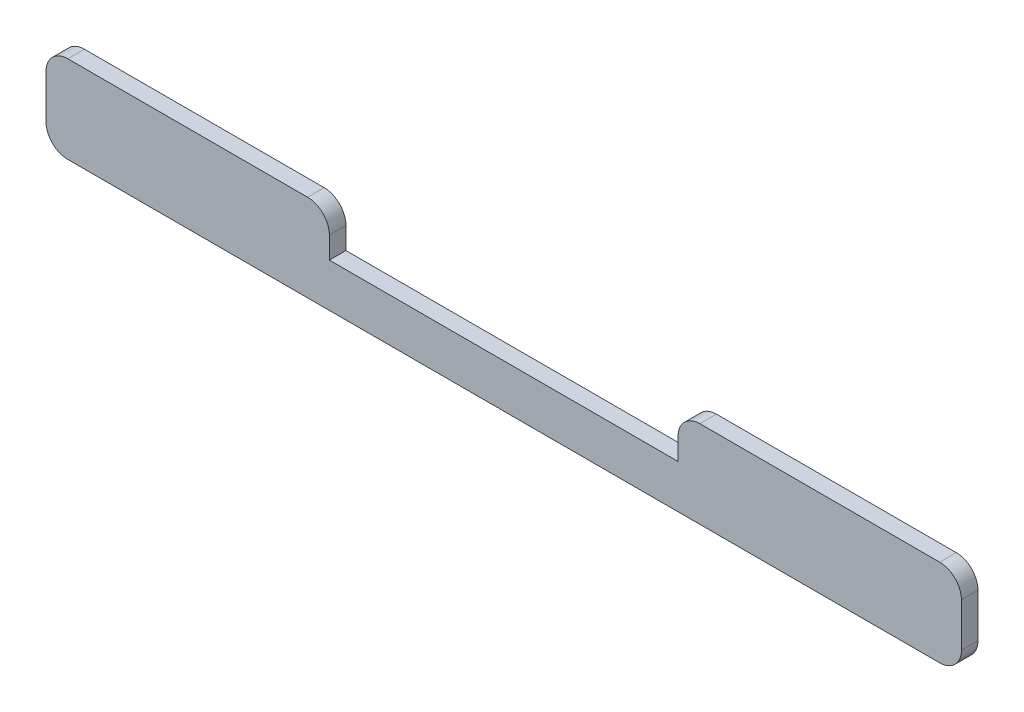
ISO-10303-21;
HEADER;
FILE_DESCRIPTION(('STEP AP214'),'2;1');
FILE_NAME('part.step','',(''),(''),'','','');
FILE_SCHEMA(('AUTOMOTIVE_DESIGN { 1 0 10303 214 1 1 1 1 }'));
ENDSEC;
DATA;
#1=APPLICATION_CONTEXT('core data for automotive mechanical design processes');
#2=APPLICATION_PROTOCOL_DEFINITION('international standard','automotive_design',2000,#1);
#3=PRODUCT_CONTEXT('',#1,'mechanical');
#4=PRODUCT('Part','Part','',(#3));
#5=PRODUCT_RELATED_PRODUCT_CATEGORY('part','',(#4));
#6=PRODUCT_DEFINITION_FORMATION('','',#4);
#7=PRODUCT_DEFINITION_CONTEXT('part definition',#1,'design');
#8=PRODUCT_DEFINITION('design','',#6,#7);
#9=PRODUCT_DEFINITION_SHAPE('','',#8);
#10=(LENGTH_UNIT() NAMED_UNIT(*) SI_UNIT(.MILLI.,.METRE.));
#11=(NAMED_UNIT(*) PLANE_ANGLE_UNIT() SI_UNIT($,.RADIAN.));
#12=(NAMED_UNIT(*) SI_UNIT($,.STERADIAN.) SOLID_ANGLE_UNIT());
#13=UNCERTAINTY_MEASURE_WITH_UNIT(LENGTH_MEASURE(1.E-05),#10,'distance_accuracy_value','');
#14=(GEOMETRIC_REPRESENTATION_CONTEXT(3) GLOBAL_UNCERTAINTY_ASSIGNED_CONTEXT((#13)) GLOBAL_UNIT_ASSIGNED_CONTEXT((#10,
#11,#12)) REPRESENTATION_CONTEXT('',''));
#15=CARTESIAN_POINT('',(0.,0.,0.));
#16=DIRECTION('',(0.,0.,1.));
#17=DIRECTION('',(1.,0.,0.));
#18=AXIS2_PLACEMENT_3D('',#15,#16,#17);
#19=CARTESIAN_POINT('',(76.2,19.05,4.826));
#20=DIRECTION('',(0.,0.,-1.));
#21=DIRECTION('',(-1.,0.,0.));
#22=AXIS2_PLACEMENT_3D('',#19,#20,#21);
#23=CYLINDRICAL_SURFACE('',#22,6.35);
#24=CARTESIAN_POINT('',(76.2,19.05,0.));
#25=DIRECTION('',(0.,0.,1.));
#26=DIRECTION('',(1.,0.,0.));
#27=AXIS2_PLACEMENT_3D('',#24,#25,#26);
#28=CIRCLE('',#27,6.35);
#29=CARTESIAN_POINT('',(76.2,25.4,0.));
#30=VERTEX_POINT('',#29);
#31=CARTESIAN_POINT('',(82.55,19.05,0.));
#32=VERTEX_POINT('',#31);
#33=EDGE_CURVE('E164',#30,#32,#28,.F.);
#34=ORIENTED_EDGE('',*,*,#33,.F.);
#35=DIRECTION('',(0.,0.,-1.));
#36=VECTOR('',#35,1.);
#37=CARTESIAN_POINT('',(76.2,25.4,4.826));
#38=LINE('',#37,#36);
#39=CARTESIAN_POINT('',(76.2,25.4,4.826));
#40=VERTEX_POINT('',#39);
#41=EDGE_CURVE('E11',#40,#30,#38,.T.);
#42=ORIENTED_EDGE('',*,*,#41,.F.);
#43=CARTESIAN_POINT('',(76.2,19.05,4.826));
#44=DIRECTION('',(0.,0.,1.));
#45=DIRECTION('',(1.,0.,0.));
#46=AXIS2_PLACEMENT_3D('',#43,#44,#45);
#47=CIRCLE('',#46,6.35);
#48=CARTESIAN_POINT('',(82.55,19.05,4.826));
#49=VERTEX_POINT('',#48);
#50=EDGE_CURVE('E201',#40,#49,#47,.F.);
#51=ORIENTED_EDGE('',*,*,#50,.T.);
#52=DIRECTION('',(0.,0.,-1.));
#53=VECTOR('',#52,1.);
#54=CARTESIAN_POINT('',(82.55,19.05,4.826));
#55=LINE('',#54,#53);
#56=EDGE_CURVE('E103',#49,#32,#55,.T.);
#57=ORIENTED_EDGE('',*,*,#56,.T.);
#58=EDGE_LOOP('',(#34,#42,#51,#57));
#59=FACE_BOUND('',#58,.T.);
#60=ADVANCED_FACE('F35',(#59),#23,.T.);
#61=CARTESIAN_POINT('',(0.,25.4,4.826));
#62=DIRECTION('',(0.,1.,0.));
#63=DIRECTION('',(0.,0.,1.));
#64=AXIS2_PLACEMENT_3D('',#61,#62,#63);
#65=PLANE('',#64);
#66=DIRECTION('',(1.,0.,0.));
#67=VECTOR('',#66,1.);
#68=CARTESIAN_POINT('',(0.,25.4,0.));
#69=LINE('',#68,#67);
#70=CARTESIAN_POINT('',(6.35000000000004,25.4,0.));
#71=VERTEX_POINT('',#70);
#72=EDGE_CURVE('E167',#71,#30,#69,.T.);
#73=ORIENTED_EDGE('',*,*,#72,.F.);
#74=DIRECTION('',(0.,0.,-1.));
#75=VECTOR('',#74,1.);
#76=CARTESIAN_POINT('',(6.35000000000004,25.4,4.826));
#77=LINE('',#76,#75);
#78=CARTESIAN_POINT('',(6.35000000000004,25.4,4.826));
#79=VERTEX_POINT('',#78);
#80=EDGE_CURVE('E43',#79,#71,#77,.T.);
#81=ORIENTED_EDGE('',*,*,#80,.F.);
#82=DIRECTION('',(1.,0.,0.));
#83=VECTOR('',#82,1.);
#84=CARTESIAN_POINT('',(0.,25.4,4.826));
#85=LINE('',#84,#83);
#86=EDGE_CURVE('E236',#79,#40,#85,.T.);
#87=ORIENTED_EDGE('',*,*,#86,.T.);
#88=ORIENTED_EDGE('',*,*,#41,.T.);
#89=EDGE_LOOP('',(#73,#81,#87,#88));
#90=FACE_BOUND('',#89,.T.);
#91=ADVANCED_FACE('F235',(#90),#65,.T.);
#92=CARTESIAN_POINT('',(6.35,19.05,4.826));
#93=DIRECTION('',(0.,0.,-1.));
#94=DIRECTION('',(-1.,0.,0.));
#95=AXIS2_PLACEMENT_3D('',#92,#93,#94);
#96=CYLINDRICAL_SURFACE('',#95,6.35);
#97=CARTESIAN_POINT('',(6.35,19.05,0.));
#98=DIRECTION('',(0.,0.,1.));
#99=DIRECTION('',(1.,0.,0.));
#100=AXIS2_PLACEMENT_3D('',#97,#98,#99);
#101=CIRCLE('',#100,6.35);
#102=CARTESIAN_POINT('',(0.,19.05,0.));
#103=VERTEX_POINT('',#102);
#104=EDGE_CURVE('E170',#71,#103,#101,.T.);
#105=ORIENTED_EDGE('',*,*,#104,.T.);
#106=DIRECTION('',(0.,0.,-1.));
#107=VECTOR('',#106,1.);
#108=CARTESIAN_POINT('',(0.,19.05,4.826));
#109=LINE('',#108,#107);
#110=CARTESIAN_POINT('',(0.,19.05,4.826));
#111=VERTEX_POINT('',#110);
#112=EDGE_CURVE('E220',#111,#103,#109,.T.);
#113=ORIENTED_EDGE('',*,*,#112,.F.);
#114=CARTESIAN_POINT('',(6.35,19.05,4.826));
#115=DIRECTION('',(0.,0.,1.));
#116=DIRECTION('',(1.,0.,0.));
#117=AXIS2_PLACEMENT_3D('',#114,#115,#116);
#118=CIRCLE('',#117,6.35);
#119=EDGE_CURVE('E226',#79,#111,#118,.T.);
#120=ORIENTED_EDGE('',*,*,#119,.F.);
#121=ORIENTED_EDGE('',*,*,#80,.T.);
#122=EDGE_LOOP('',(#105,#113,#120,#121));
#123=FACE_BOUND('',#122,.T.);
#124=ADVANCED_FACE('F224',(#123),#96,.T.);
#125=CARTESIAN_POINT('',(0.,0.,4.826));
#126=DIRECTION('',(-1.,0.,0.));
#127=DIRECTION('',(0.,0.,1.));
#128=AXIS2_PLACEMENT_3D('',#125,#126,#127);
#129=PLANE('',#128);
#130=DIRECTION('',(0.,1.,0.));
#131=VECTOR('',#130,1.);
#132=CARTESIAN_POINT('',(0.,0.,0.));
#133=LINE('',#132,#131);
#134=CARTESIAN_POINT('',(0.,6.35000000000004,0.));
#135=VERTEX_POINT('',#134);
#136=EDGE_CURVE('E173',#135,#103,#133,.T.);
#137=ORIENTED_EDGE('',*,*,#136,.F.);
#138=DIRECTION('',(0.,0.,-1.));
#139=VECTOR('',#138,1.);
#140=CARTESIAN_POINT('',(0.,6.35000000000004,4.826));
#141=LINE('',#140,#139);
#142=CARTESIAN_POINT('',(0.,6.35000000000004,4.826));
#143=VERTEX_POINT('',#142);
#144=EDGE_CURVE('E218',#143,#135,#141,.T.);
#145=ORIENTED_EDGE('',*,*,#144,.F.);
#146=DIRECTION('',(0.,1.,0.));
#147=VECTOR('',#146,1.);
#148=CARTESIAN_POINT('',(0.,0.,4.826));
#149=LINE('',#148,#147);
#150=EDGE_CURVE('E242',#143,#111,#149,.T.);
#151=ORIENTED_EDGE('',*,*,#150,.T.);
#152=ORIENTED_EDGE('',*,*,#112,.T.);
#153=EDGE_LOOP('',(#137,#145,#151,#152));
#154=FACE_BOUND('',#153,.T.);
#155=ADVANCED_FACE('F288',(#154),#129,.T.);
#156=CARTESIAN_POINT('',(6.35,6.35,4.826));
#157=DIRECTION('',(0.,0.,-1.));
#158=DIRECTION('',(-1.,0.,0.));
#159=AXIS2_PLACEMENT_3D('',#156,#157,#158);
#160=CYLINDRICAL_SURFACE('',#159,6.35);
#161=CARTESIAN_POINT('',(6.35,6.35,0.));
#162=DIRECTION('',(0.,0.,1.));
#163=DIRECTION('',(1.,0.,0.));
#164=AXIS2_PLACEMENT_3D('',#161,#162,#163);
#165=CIRCLE('',#164,6.35);
#166=CARTESIAN_POINT('',(6.35000000000004,0.,0.));
#167=VERTEX_POINT('',#166);
#168=EDGE_CURVE('E176',#135,#167,#165,.T.);
#169=ORIENTED_EDGE('',*,*,#168,.T.);
#170=DIRECTION('',(0.,0.,-1.));
#171=VECTOR('',#170,1.);
#172=CARTESIAN_POINT('',(6.35000000000004,0.,4.826));
#173=LINE('',#172,#171);
#174=CARTESIAN_POINT('',(6.35000000000004,0.,4.826));
#175=VERTEX_POINT('',#174);
#176=EDGE_CURVE('E215',#175,#167,#173,.T.);
#177=ORIENTED_EDGE('',*,*,#176,.F.);
#178=CARTESIAN_POINT('',(6.35,6.35,4.826));
#179=DIRECTION('',(0.,0.,1.));
#180=DIRECTION('',(1.,0.,0.));
#181=AXIS2_PLACEMENT_3D('',#178,#179,#180);
#182=CIRCLE('',#181,6.35);
#183=EDGE_CURVE('E245',#143,#175,#182,.T.);
#184=ORIENTED_EDGE('',*,*,#183,.F.);
#185=ORIENTED_EDGE('',*,*,#144,.T.);
#186=EDGE_LOOP('',(#169,#177,#184,#185));
#187=FACE_BOUND('',#186,.T.);
#188=ADVANCED_FACE('F293',(#187),#160,.T.);
#189=CARTESIAN_POINT('',(0.,0.,4.826));
#190=DIRECTION('',(0.,1.,0.));
#191=DIRECTION('',(0.,0.,1.));
#192=AXIS2_PLACEMENT_3D('',#189,#190,#191);
#193=PLANE('',#192);
#194=DIRECTION('',(1.,0.,0.));
#195=VECTOR('',#194,1.);
#196=CARTESIAN_POINT('',(0.,0.,0.));
#197=LINE('',#196,#195);
#198=CARTESIAN_POINT('',(260.35,0.,0.));
#199=VERTEX_POINT('',#198);
#200=EDGE_CURVE('E178',#167,#199,#197,.T.);
#201=ORIENTED_EDGE('',*,*,#200,.T.);
#202=DIRECTION('',(0.,0.,-1.));
#203=VECTOR('',#202,1.);
#204=CARTESIAN_POINT('',(260.35,0.,4.826));
#205=LINE('',#204,#203);
#206=CARTESIAN_POINT('',(260.35,0.,4.826));
#207=VERTEX_POINT('',#206);
#208=EDGE_CURVE('E213',#207,#199,#205,.T.);
#209=ORIENTED_EDGE('',*,*,#208,.F.);
#210=DIRECTION('',(1.,0.,0.));
#211=VECTOR('',#210,1.);
#212=CARTESIAN_POINT('',(0.,0.,4.826));
#213=LINE('',#212,#211);
#214=EDGE_CURVE('E247',#175,#207,#213,.T.);
#215=ORIENTED_EDGE('',*,*,#214,.F.);
#216=ORIENTED_EDGE('',*,*,#176,.T.);
#217=EDGE_LOOP('',(#201,#209,#215,#216));
#218=FACE_BOUND('',#217,.T.);
#219=ADVANCED_FACE('F297',(#218),#193,.F.);
#220=CARTESIAN_POINT('',(260.35,6.35,4.826));
#221=DIRECTION('',(0.,0.,-1.));
#222=DIRECTION('',(-1.,0.,0.));
#223=AXIS2_PLACEMENT_3D('',#220,#221,#222);
#224=CYLINDRICAL_SURFACE('',#223,6.35000000000001);
#225=CARTESIAN_POINT('',(260.35,6.35,0.));
#226=DIRECTION('',(0.,0.,1.));
#227=DIRECTION('',(1.,0.,0.));
#228=AXIS2_PLACEMENT_3D('',#225,#226,#227);
#229=CIRCLE('',#228,6.35000000000001);
#230=CARTESIAN_POINT('',(266.7,6.35000000000004,0.));
#231=VERTEX_POINT('',#230);
#232=EDGE_CURVE('E181',#231,#199,#229,.F.);
#233=ORIENTED_EDGE('',*,*,#232,.F.);
#234=DIRECTION('',(0.,0.,-1.));
#235=VECTOR('',#234,1.);
#236=CARTESIAN_POINT('',(266.7,6.35000000000004,4.826));
#237=LINE('',#236,#235);
#238=CARTESIAN_POINT('',(266.7,6.35000000000004,4.826));
#239=VERTEX_POINT('',#238);
#240=EDGE_CURVE('E211',#239,#231,#237,.T.);
#241=ORIENTED_EDGE('',*,*,#240,.F.);
#242=CARTESIAN_POINT('',(260.35,6.35,4.826));
#243=DIRECTION('',(0.,0.,1.));
#244=DIRECTION('',(1.,0.,0.));
#245=AXIS2_PLACEMENT_3D('',#242,#243,#244);
#246=CIRCLE('',#245,6.35000000000001);
#247=EDGE_CURVE('E249',#239,#207,#246,.F.);
#248=ORIENTED_EDGE('',*,*,#247,.T.);
#249=ORIENTED_EDGE('',*,*,#208,.T.);
#250=EDGE_LOOP('',(#233,#241,#248,#249));
#251=FACE_BOUND('',#250,.T.);
#252=ADVANCED_FACE('F301',(#251),#224,.T.);
#253=CARTESIAN_POINT('',(266.7,0.,4.826));
#254=DIRECTION('',(-1.,0.,0.));
#255=DIRECTION('',(0.,0.,1.));
#256=AXIS2_PLACEMENT_3D('',#253,#254,#255);
#257=PLANE('',#256);
#258=DIRECTION('',(0.,1.,0.));
#259=VECTOR('',#258,1.);
#260=CARTESIAN_POINT('',(266.7,0.,0.));
#261=LINE('',#260,#259);
#262=CARTESIAN_POINT('',(266.7,19.05,0.));
#263=VERTEX_POINT('',#262);
#264=EDGE_CURVE('E184',#231,#263,#261,.T.);
#265=ORIENTED_EDGE('',*,*,#264,.T.);
#266=DIRECTION('',(0.,0.,-1.));
#267=VECTOR('',#266,1.);
#268=CARTESIAN_POINT('',(266.7,19.05,4.826));
#269=LINE('',#268,#267);
#270=CARTESIAN_POINT('',(266.7,19.05,4.826));
#271=VERTEX_POINT('',#270);
#272=EDGE_CURVE('E209',#271,#263,#269,.T.);
#273=ORIENTED_EDGE('',*,*,#272,.F.);
#274=DIRECTION('',(0.,1.,0.));
#275=VECTOR('',#274,1.);
#276=CARTESIAN_POINT('',(266.7,0.,4.826));
#277=LINE('',#276,#275);
#278=EDGE_CURVE('E252',#239,#271,#277,.T.);
#279=ORIENTED_EDGE('',*,*,#278,.F.);
#280=ORIENTED_EDGE('',*,*,#240,.T.);
#281=EDGE_LOOP('',(#265,#273,#279,#280));
#282=FACE_BOUND('',#281,.T.);
#283=ADVANCED_FACE('F305',(#282),#257,.F.);
#284=CARTESIAN_POINT('',(260.35,19.05,4.826));
#285=DIRECTION('',(0.,0.,-1.));
#286=DIRECTION('',(-1.,0.,0.));
#287=AXIS2_PLACEMENT_3D('',#284,#285,#286);
#288=CYLINDRICAL_SURFACE('',#287,6.35000000000001);
#289=CARTESIAN_POINT('',(260.35,19.05,0.));
#290=DIRECTION('',(0.,0.,1.));
#291=DIRECTION('',(1.,0.,0.));
#292=AXIS2_PLACEMENT_3D('',#289,#290,#291);
#293=CIRCLE('',#292,6.35000000000001);
#294=CARTESIAN_POINT('',(260.35,25.4,0.));
#295=VERTEX_POINT('',#294);
#296=EDGE_CURVE('E187',#295,#263,#293,.F.);
#297=ORIENTED_EDGE('',*,*,#296,.F.);
#298=DIRECTION('',(0.,0.,-1.));
#299=VECTOR('',#298,1.);
#300=CARTESIAN_POINT('',(260.35,25.4,4.826));
#301=LINE('',#300,#299);
#302=CARTESIAN_POINT('',(260.35,25.4,4.826));
#303=VERTEX_POINT('',#302);
#304=EDGE_CURVE('E207',#303,#295,#301,.T.);
#305=ORIENTED_EDGE('',*,*,#304,.F.);
#306=CARTESIAN_POINT('',(260.35,19.05,4.826));
#307=DIRECTION('',(0.,0.,1.));
#308=DIRECTION('',(1.,0.,0.));
#309=AXIS2_PLACEMENT_3D('',#306,#307,#308);
#310=CIRCLE('',#309,6.35000000000001);
#311=EDGE_CURVE('E254',#303,#271,#310,.F.);
#312=ORIENTED_EDGE('',*,*,#311,.T.);
#313=ORIENTED_EDGE('',*,*,#272,.T.);
#314=EDGE_LOOP('',(#297,#305,#312,#313));
#315=FACE_BOUND('',#314,.T.);
#316=ADVANCED_FACE('F268',(#315),#288,.T.);
#317=CARTESIAN_POINT('',(0.,25.4,4.826));
#318=DIRECTION('',(0.,1.,0.));
#319=DIRECTION('',(0.,0.,1.));
#320=AXIS2_PLACEMENT_3D('',#317,#318,#319);
#321=PLANE('',#320);
#322=DIRECTION('',(1.,0.,0.));
#323=VECTOR('',#322,1.);
#324=CARTESIAN_POINT('',(0.,25.4,0.));
#325=LINE('',#324,#323);
#326=CARTESIAN_POINT('',(190.5,25.4,0.));
#327=VERTEX_POINT('',#326);
#328=EDGE_CURVE('E190',#327,#295,#325,.T.);
#329=ORIENTED_EDGE('',*,*,#328,.F.);
#330=DIRECTION('',(0.,0.,-1.));
#331=VECTOR('',#330,1.);
#332=CARTESIAN_POINT('',(190.5,25.4,4.826));
#333=LINE('',#332,#331);
#334=CARTESIAN_POINT('',(190.5,25.4,4.826));
#335=VERTEX_POINT('',#334);
#336=EDGE_CURVE('E205',#335,#327,#333,.T.);
#337=ORIENTED_EDGE('',*,*,#336,.F.);
#338=DIRECTION('',(1.,0.,0.));
#339=VECTOR('',#338,1.);
#340=CARTESIAN_POINT('',(0.,25.4,4.826));
#341=LINE('',#340,#339);
#342=EDGE_CURVE('E257',#335,#303,#341,.T.);
#343=ORIENTED_EDGE('',*,*,#342,.T.);
#344=ORIENTED_EDGE('',*,*,#304,.T.);
#345=EDGE_LOOP('',(#329,#337,#343,#344));
#346=FACE_BOUND('',#345,.T.);
#347=ADVANCED_FACE('F261',(#346),#321,.T.);
#348=CARTESIAN_POINT('',(190.5,19.05,4.826));
#349=DIRECTION('',(0.,0.,-1.));
#350=DIRECTION('',(-1.,0.,0.));
#351=AXIS2_PLACEMENT_3D('',#348,#349,#350);
#352=CYLINDRICAL_SURFACE('',#351,6.35);
#353=CARTESIAN_POINT('',(190.5,19.05,0.));
#354=DIRECTION('',(0.,0.,1.));
#355=DIRECTION('',(1.,0.,0.));
#356=AXIS2_PLACEMENT_3D('',#353,#354,#355);
#357=CIRCLE('',#356,6.35);
#358=CARTESIAN_POINT('',(184.15,19.05,0.));
#359=VERTEX_POINT('',#358);
#360=EDGE_CURVE('E193',#327,#359,#357,.T.);
#361=ORIENTED_EDGE('',*,*,#360,.T.);
#362=DIRECTION('',(0.,0.,-1.));
#363=VECTOR('',#362,1.);
#364=CARTESIAN_POINT('',(184.15,19.05,4.826));
#365=LINE('',#364,#363);
#366=CARTESIAN_POINT('',(184.15,19.05,4.826));
#367=VERTEX_POINT('',#366);
#368=EDGE_CURVE('E150',#367,#359,#365,.T.);
#369=ORIENTED_EDGE('',*,*,#368,.F.);
#370=CARTESIAN_POINT('',(190.5,19.05,4.826));
#371=DIRECTION('',(0.,0.,1.));
#372=DIRECTION('',(1.,0.,0.));
#373=AXIS2_PLACEMENT_3D('',#370,#371,#372);
#374=CIRCLE('',#373,6.35);
#375=EDGE_CURVE('E156',#335,#367,#374,.T.);
#376=ORIENTED_EDGE('',*,*,#375,.F.);
#377=ORIENTED_EDGE('',*,*,#336,.T.);
#378=EDGE_LOOP('',(#361,#369,#376,#377));
#379=FACE_BOUND('',#378,.T.);
#380=ADVANCED_FACE('F272',(#379),#352,.T.);
#381=CARTESIAN_POINT('',(184.15,0.,4.826));
#382=DIRECTION('',(-1.,0.,0.));
#383=DIRECTION('',(0.,0.,1.));
#384=AXIS2_PLACEMENT_3D('',#381,#382,#383);
#385=PLANE('',#384);
#386=DIRECTION('',(0.,1.,0.));
#387=VECTOR('',#386,1.);
#388=CARTESIAN_POINT('',(184.15,0.,0.));
#389=LINE('',#388,#387);
#390=CARTESIAN_POINT('',(184.15,12.7,0.));
#391=VERTEX_POINT('',#390);
#392=EDGE_CURVE('E145',#391,#359,#389,.T.);
#393=ORIENTED_EDGE('',*,*,#392,.F.);
#394=DIRECTION('',(0.,0.,-1.));
#395=VECTOR('',#394,1.);
#396=CARTESIAN_POINT('',(184.15,12.7,4.826));
#397=LINE('',#396,#395);
#398=CARTESIAN_POINT('',(184.15,12.7,4.826));
#399=VERTEX_POINT('',#398);
#400=EDGE_CURVE('E140',#399,#391,#397,.T.);
#401=ORIENTED_EDGE('',*,*,#400,.F.);
#402=DIRECTION('',(0.,1.,0.));
#403=VECTOR('',#402,1.);
#404=CARTESIAN_POINT('',(184.15,0.,4.826));
#405=LINE('',#404,#403);
#406=EDGE_CURVE('E143',#399,#367,#405,.T.);
#407=ORIENTED_EDGE('',*,*,#406,.T.);
#408=ORIENTED_EDGE('',*,*,#368,.T.);
#409=EDGE_LOOP('',(#393,#401,#407,#408));
#410=FACE_BOUND('',#409,.T.);
#411=ADVANCED_FACE('F142',(#410),#385,.T.);
#412=CARTESIAN_POINT('',(0.,12.7,4.826));
#413=DIRECTION('',(0.,1.,0.));
#414=DIRECTION('',(0.,0.,1.));
#415=AXIS2_PLACEMENT_3D('',#412,#413,#414);
#416=PLANE('',#415);
#417=DIRECTION('',(1.,0.,0.));
#418=VECTOR('',#417,1.);
#419=CARTESIAN_POINT('',(0.,12.7,0.));
#420=LINE('',#419,#418);
#421=CARTESIAN_POINT('',(82.55,12.7,0.));
#422=VERTEX_POINT('',#421);
#423=EDGE_CURVE('E197',#422,#391,#420,.T.);
#424=ORIENTED_EDGE('',*,*,#423,.F.);
#425=DIRECTION('',(0.,0.,-1.));
#426=VECTOR('',#425,1.);
#427=CARTESIAN_POINT('',(82.55,12.7,4.826));
#428=LINE('',#427,#426);
#429=CARTESIAN_POINT('',(82.55,12.7,4.826));
#430=VERTEX_POINT('',#429);
#431=EDGE_CURVE('E96',#430,#422,#428,.T.);
#432=ORIENTED_EDGE('',*,*,#431,.F.);
#433=DIRECTION('',(1.,0.,0.));
#434=VECTOR('',#433,1.);
#435=CARTESIAN_POINT('',(0.,12.7,4.826));
#436=LINE('',#435,#434);
#437=EDGE_CURVE('E153',#430,#399,#436,.T.);
#438=ORIENTED_EDGE('',*,*,#437,.T.);
#439=ORIENTED_EDGE('',*,*,#400,.T.);
#440=EDGE_LOOP('',(#424,#432,#438,#439));
#441=FACE_BOUND('',#440,.T.);
#442=ADVANCED_FACE('F159',(#441),#416,.T.);
#443=CARTESIAN_POINT('',(82.55,-3.60822483003178E-13,4.826));
#444=DIRECTION('',(-1.,0.,0.));
#445=DIRECTION('',(0.,-1.,0.));
#446=AXIS2_PLACEMENT_3D('',#443,#444,#445);
#447=PLANE('',#446);
#448=DIRECTION('',(0.,1.,0.));
#449=VECTOR('',#448,1.);
#450=CARTESIAN_POINT('',(82.55,-3.60822483003178E-13,0.));
#451=LINE('',#450,#449);
#452=EDGE_CURVE('E199',#422,#32,#451,.T.);
#453=ORIENTED_EDGE('',*,*,#452,.T.);
#454=ORIENTED_EDGE('',*,*,#56,.F.);
#455=DIRECTION('',(0.,1.,0.));
#456=VECTOR('',#455,1.);
#457=CARTESIAN_POINT('',(82.55,-3.60822483003178E-13,4.826));
#458=LINE('',#457,#456);
#459=EDGE_CURVE('E51',#430,#49,#458,.T.);
#460=ORIENTED_EDGE('',*,*,#459,.F.);
#461=ORIENTED_EDGE('',*,*,#431,.T.);
#462=EDGE_LOOP('',(#453,#454,#460,#461));
#463=FACE_BOUND('',#462,.T.);
#464=ADVANCED_FACE('F237',(#463),#447,.F.);
#465=CARTESIAN_POINT('',(0.,0.,4.826));
#466=DIRECTION('',(0.,0.,1.));
#467=DIRECTION('',(1.,0.,0.));
#468=AXIS2_PLACEMENT_3D('',#465,#466,#467);
#469=PLANE('',#468);
#470=ORIENTED_EDGE('',*,*,#50,.F.);
#471=ORIENTED_EDGE('',*,*,#86,.F.);
#472=ORIENTED_EDGE('',*,*,#119,.T.);
#473=ORIENTED_EDGE('',*,*,#150,.F.);
#474=ORIENTED_EDGE('',*,*,#183,.T.);
#475=ORIENTED_EDGE('',*,*,#214,.T.);
#476=ORIENTED_EDGE('',*,*,#247,.F.);
#477=ORIENTED_EDGE('',*,*,#278,.T.);
#478=ORIENTED_EDGE('',*,*,#311,.F.);
#479=ORIENTED_EDGE('',*,*,#342,.F.);
#480=ORIENTED_EDGE('',*,*,#375,.T.);
#481=ORIENTED_EDGE('',*,*,#406,.F.);
#482=ORIENTED_EDGE('',*,*,#437,.F.);
#483=ORIENTED_EDGE('',*,*,#459,.T.);
#484=EDGE_LOOP('',(#470,#471,#472,#473,#474,#475,#476,#477,#478,#479,#480,#481,#482,#483));
#485=FACE_BOUND('',#484,.T.);
#486=ADVANCED_FACE('F152',(#485),#469,.T.);
#487=CARTESIAN_POINT('',(0.,0.,0.));
#488=DIRECTION('',(0.,0.,1.));
#489=DIRECTION('',(1.,0.,0.));
#490=AXIS2_PLACEMENT_3D('',#487,#488,#489);
#491=PLANE('',#490);
#492=ORIENTED_EDGE('',*,*,#33,.T.);
#493=ORIENTED_EDGE('',*,*,#452,.F.);
#494=ORIENTED_EDGE('',*,*,#423,.T.);
#495=ORIENTED_EDGE('',*,*,#392,.T.);
#496=ORIENTED_EDGE('',*,*,#360,.F.);
#497=ORIENTED_EDGE('',*,*,#328,.T.);
#498=ORIENTED_EDGE('',*,*,#296,.T.);
#499=ORIENTED_EDGE('',*,*,#264,.F.);
#500=ORIENTED_EDGE('',*,*,#232,.T.);
#501=ORIENTED_EDGE('',*,*,#200,.F.);
#502=ORIENTED_EDGE('',*,*,#168,.F.);
#503=ORIENTED_EDGE('',*,*,#136,.T.);
#504=ORIENTED_EDGE('',*,*,#104,.F.);
#505=ORIENTED_EDGE('',*,*,#72,.T.);
#506=EDGE_LOOP('',(#492,#493,#494,#495,#496,#497,#498,#499,#500,#501,#502,#503,#504,#505));
#507=FACE_BOUND('',#506,.T.);
#508=ADVANCED_FACE('F232',(#507),#491,.F.);
#509=CLOSED_SHELL('',(#60,#91,#124,#155,#188,#219,#252,#283,#316,#347,#380,#411,#442,#464,#486,#508));
#510=MANIFOLD_SOLID_BREP('B2',#509);
#511=ADVANCED_BREP_SHAPE_REPRESENTATION('',(#18,#510),#14);
#512=SHAPE_DEFINITION_REPRESENTATION(#9,#511);
ENDSEC;
END-ISO-10303-21;
